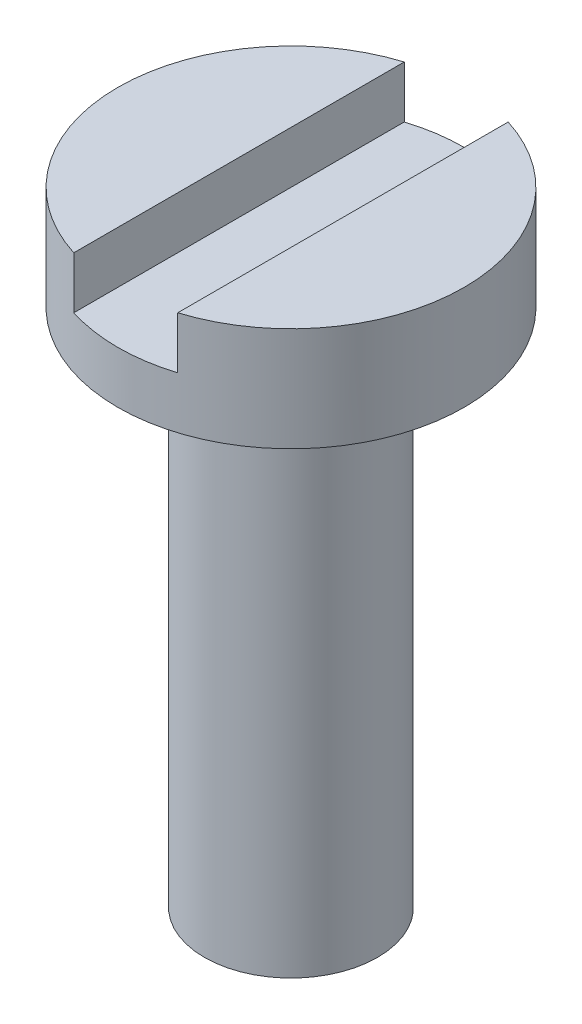
ISO-10303-21;
HEADER;
FILE_DESCRIPTION(('STEP AP214'),'2;1');
FILE_NAME('part.step','',(''),(''),'','','');
FILE_SCHEMA(('AUTOMOTIVE_DESIGN { 1 0 10303 214 1 1 1 1 }'));
ENDSEC;
DATA;
#1=APPLICATION_CONTEXT('core data for automotive mechanical design processes');
#2=APPLICATION_PROTOCOL_DEFINITION('international standard','automotive_design',2000,#1);
#3=PRODUCT_CONTEXT('',#1,'mechanical');
#4=PRODUCT('Part','Part','',(#3));
#5=PRODUCT_RELATED_PRODUCT_CATEGORY('part','',(#4));
#6=PRODUCT_DEFINITION_FORMATION('','',#4);
#7=PRODUCT_DEFINITION_CONTEXT('part definition',#1,'design');
#8=PRODUCT_DEFINITION('design','',#6,#7);
#9=PRODUCT_DEFINITION_SHAPE('','',#8);
#10=(LENGTH_UNIT() NAMED_UNIT(*) SI_UNIT(.MILLI.,.METRE.));
#11=(NAMED_UNIT(*) PLANE_ANGLE_UNIT() SI_UNIT($,.RADIAN.));
#12=(NAMED_UNIT(*) SI_UNIT($,.STERADIAN.) SOLID_ANGLE_UNIT());
#13=UNCERTAINTY_MEASURE_WITH_UNIT(LENGTH_MEASURE(1.E-05),#10,'distance_accuracy_value','');
#14=(GEOMETRIC_REPRESENTATION_CONTEXT(3) GLOBAL_UNCERTAINTY_ASSIGNED_CONTEXT((#13)) GLOBAL_UNIT_ASSIGNED_CONTEXT((#10,
#11,#12)) REPRESENTATION_CONTEXT('',''));
#15=CARTESIAN_POINT('',(0.,0.,0.));
#16=DIRECTION('',(0.,0.,1.));
#17=DIRECTION('',(1.,0.,0.));
#18=AXIS2_PLACEMENT_3D('',#15,#16,#17);
#19=CARTESIAN_POINT('',(0.,18.,0.));
#20=DIRECTION('',(0.,1.,0.));
#21=DIRECTION('',(0.,0.,1.));
#22=AXIS2_PLACEMENT_3D('',#19,#20,#21);
#23=PLANE('',#22);
#24=DIRECTION('',(0.,0.,-1.));
#25=VECTOR('',#24,1.);
#26=CARTESIAN_POINT('',(1.5,18.,-4.76969600708473));
#27=LINE('',#26,#25);
#28=CARTESIAN_POINT('',(1.5,18.,4.76969600708473));
#29=VERTEX_POINT('',#28);
#30=CARTESIAN_POINT('',(1.5,18.,-4.76969600708473));
#31=VERTEX_POINT('',#30);
#32=EDGE_CURVE('E82',#29,#31,#27,.T.);
#33=ORIENTED_EDGE('',*,*,#32,.F.);
#34=CARTESIAN_POINT('',(0.,18.,0.));
#35=DIRECTION('',(0.,1.,0.));
#36=DIRECTION('',(0.,0.,1.));
#37=AXIS2_PLACEMENT_3D('',#34,#35,#36);
#38=CIRCLE('',#37,5.);
#39=EDGE_CURVE('E128',#29,#31,#38,.T.);
#40=ORIENTED_EDGE('',*,*,#39,.T.);
#41=EDGE_LOOP('',(#33,#40));
#42=FACE_BOUND('',#41,.T.);
#43=ADVANCED_FACE('F43',(#42),#23,.T.);
#44=CARTESIAN_POINT('',(0.,15.,0.));
#45=DIRECTION('',(0.,-1.,0.));
#46=DIRECTION('',(0.,0.,-1.));
#47=AXIS2_PLACEMENT_3D('',#44,#45,#46);
#48=CYLINDRICAL_SURFACE('',#47,2.5);
#49=CARTESIAN_POINT('',(0.,15.,0.));
#50=DIRECTION('',(0.,1.,0.));
#51=DIRECTION('',(0.,0.,1.));
#52=AXIS2_PLACEMENT_3D('',#49,#50,#51);
#53=CIRCLE('',#52,2.5);
#54=CARTESIAN_POINT('',(0.,15.,2.5));
#55=VERTEX_POINT('',#54);
#56=EDGE_CURVE('E11',#55,#55,#53,.T.);
#57=ORIENTED_EDGE('',*,*,#56,.F.);
#58=EDGE_LOOP('',(#57));
#59=FACE_BOUND('',#58,.T.);
#60=CARTESIAN_POINT('',(0.,0.,0.));
#61=DIRECTION('',(0.,1.,0.));
#62=DIRECTION('',(0.,0.,1.));
#63=AXIS2_PLACEMENT_3D('',#60,#61,#62);
#64=CIRCLE('',#63,2.5);
#65=CARTESIAN_POINT('',(0.,0.,2.5));
#66=VERTEX_POINT('',#65);
#67=EDGE_CURVE('E47',#66,#66,#64,.T.);
#68=ORIENTED_EDGE('',*,*,#67,.T.);
#69=EDGE_LOOP('',(#68));
#70=FACE_BOUND('',#69,.T.);
#71=ADVANCED_FACE('F45',(#59,#70),#48,.T.);
#72=CARTESIAN_POINT('',(0.,0.,0.));
#73=DIRECTION('',(0.,1.,0.));
#74=DIRECTION('',(0.,0.,1.));
#75=AXIS2_PLACEMENT_3D('',#72,#73,#74);
#76=PLANE('',#75);
#77=ORIENTED_EDGE('',*,*,#67,.F.);
#78=EDGE_LOOP('',(#77));
#79=FACE_BOUND('',#78,.T.);
#80=ADVANCED_FACE('F146',(#79),#76,.F.);
#81=CARTESIAN_POINT('',(0.,18.,0.));
#82=DIRECTION('',(0.,-1.,0.));
#83=DIRECTION('',(0.,0.,-1.));
#84=AXIS2_PLACEMENT_3D('',#81,#82,#83);
#85=CYLINDRICAL_SURFACE('',#84,5.);
#86=CARTESIAN_POINT('',(0.,16.5,0.));
#87=DIRECTION('',(0.,1.,0.));
#88=DIRECTION('',(0.,0.,1.));
#89=AXIS2_PLACEMENT_3D('',#86,#87,#88);
#90=CIRCLE('',#89,5.);
#91=CARTESIAN_POINT('',(1.5,16.5,-4.76969600708473));
#92=VERTEX_POINT('',#91);
#93=CARTESIAN_POINT('',(-1.5,16.5,-4.76969600708473));
#94=VERTEX_POINT('',#93);
#95=EDGE_CURVE('E103',#92,#94,#90,.T.);
#96=ORIENTED_EDGE('',*,*,#95,.F.);
#97=DIRECTION('',(0.,1.,0.));
#98=VECTOR('',#97,1.);
#99=CARTESIAN_POINT('',(1.5,16.5,-4.76969600708473));
#100=LINE('',#99,#98);
#101=EDGE_CURVE('E68',#92,#31,#100,.T.);
#102=ORIENTED_EDGE('',*,*,#101,.T.);
#103=ORIENTED_EDGE('',*,*,#39,.F.);
#104=DIRECTION('',(0.,1.,0.));
#105=VECTOR('',#104,1.);
#106=CARTESIAN_POINT('',(1.5,16.5,4.76969600708473));
#107=LINE('',#106,#105);
#108=CARTESIAN_POINT('',(1.5,16.5,4.76969600708473));
#109=VERTEX_POINT('',#108);
#110=EDGE_CURVE('E97',#109,#29,#107,.T.);
#111=ORIENTED_EDGE('',*,*,#110,.F.);
#112=CARTESIAN_POINT('',(0.,16.5,0.));
#113=DIRECTION('',(0.,1.,0.));
#114=DIRECTION('',(0.,0.,1.));
#115=AXIS2_PLACEMENT_3D('',#112,#113,#114);
#116=CIRCLE('',#115,5.);
#117=CARTESIAN_POINT('',(-1.5,16.5,4.76969600708473));
#118=VERTEX_POINT('',#117);
#119=EDGE_CURVE('E101',#118,#109,#116,.T.);
#120=ORIENTED_EDGE('',*,*,#119,.F.);
#121=DIRECTION('',(0.,1.,0.));
#122=VECTOR('',#121,1.);
#123=CARTESIAN_POINT('',(-1.5,16.5,4.76969600708473));
#124=LINE('',#123,#122);
#125=CARTESIAN_POINT('',(-1.5,18.,4.76969600708473));
#126=VERTEX_POINT('',#125);
#127=EDGE_CURVE('E89',#118,#126,#124,.T.);
#128=ORIENTED_EDGE('',*,*,#127,.T.);
#129=CARTESIAN_POINT('',(-1.5,18.,-4.76969600708473));
#130=VERTEX_POINT('',#129);
#131=EDGE_CURVE('E132',#130,#126,#38,.T.);
#132=ORIENTED_EDGE('',*,*,#131,.F.);
#133=DIRECTION('',(0.,1.,0.));
#134=VECTOR('',#133,1.);
#135=CARTESIAN_POINT('',(-1.5,16.5,-4.76969600708473));
#136=LINE('',#135,#134);
#137=EDGE_CURVE('E59',#94,#130,#136,.T.);
#138=ORIENTED_EDGE('',*,*,#137,.F.);
#139=EDGE_LOOP('',(#96,#102,#103,#111,#120,#128,#132,#138));
#140=FACE_BOUND('',#139,.T.);
#141=CARTESIAN_POINT('',(0.,15.,0.));
#142=DIRECTION('',(0.,1.,0.));
#143=DIRECTION('',(0.,0.,1.));
#144=AXIS2_PLACEMENT_3D('',#141,#142,#143);
#145=CIRCLE('',#144,5.);
#146=CARTESIAN_POINT('',(0.,15.,5.));
#147=VERTEX_POINT('',#146);
#148=EDGE_CURVE('E123',#147,#147,#145,.T.);
#149=ORIENTED_EDGE('',*,*,#148,.T.);
#150=EDGE_LOOP('',(#149));
#151=FACE_BOUND('',#150,.T.);
#152=ADVANCED_FACE('F107',(#140,#151),#85,.T.);
#153=DIRECTION('',(0.,0.,1.));
#154=VECTOR('',#153,1.);
#155=CARTESIAN_POINT('',(-1.5,18.,-4.76969600708473));
#156=LINE('',#155,#154);
#157=EDGE_CURVE('E91',#130,#126,#156,.T.);
#158=ORIENTED_EDGE('',*,*,#157,.F.);
#159=ORIENTED_EDGE('',*,*,#131,.T.);
#160=EDGE_LOOP('',(#158,#159));
#161=FACE_BOUND('',#160,.T.);
#162=ADVANCED_FACE('F138',(#161),#23,.T.);
#163=CARTESIAN_POINT('',(0.,15.,0.));
#164=DIRECTION('',(0.,1.,0.));
#165=DIRECTION('',(0.,0.,1.));
#166=AXIS2_PLACEMENT_3D('',#163,#164,#165);
#167=PLANE('',#166);
#168=ORIENTED_EDGE('',*,*,#56,.T.);
#169=EDGE_LOOP('',(#168));
#170=FACE_BOUND('',#169,.T.);
#171=ORIENTED_EDGE('',*,*,#148,.F.);
#172=EDGE_LOOP('',(#171));
#173=FACE_BOUND('',#172,.T.);
#174=ADVANCED_FACE('F151',(#170,#173),#167,.F.);
#175=CARTESIAN_POINT('',(1.5,16.5,-4.76969600708473));
#176=DIRECTION('',(1.,0.,0.));
#177=DIRECTION('',(0.,0.,-1.));
#178=AXIS2_PLACEMENT_3D('',#175,#176,#177);
#179=PLANE('',#178);
#180=ORIENTED_EDGE('',*,*,#32,.T.);
#181=ORIENTED_EDGE('',*,*,#101,.F.);
#182=DIRECTION('',(0.,0.,-1.));
#183=VECTOR('',#182,1.);
#184=CARTESIAN_POINT('',(1.5,16.5,-4.76969600708473));
#185=LINE('',#184,#183);
#186=EDGE_CURVE('E111',#109,#92,#185,.T.);
#187=ORIENTED_EDGE('',*,*,#186,.F.);
#188=ORIENTED_EDGE('',*,*,#110,.T.);
#189=EDGE_LOOP('',(#180,#181,#187,#188));
#190=FACE_BOUND('',#189,.T.);
#191=ADVANCED_FACE('F156',(#190),#179,.F.);
#192=CARTESIAN_POINT('',(-1.5,16.5,-4.76969600708473));
#193=DIRECTION('',(-1.,0.,0.));
#194=DIRECTION('',(0.,0.,1.));
#195=AXIS2_PLACEMENT_3D('',#192,#193,#194);
#196=PLANE('',#195);
#197=ORIENTED_EDGE('',*,*,#157,.T.);
#198=ORIENTED_EDGE('',*,*,#127,.F.);
#199=DIRECTION('',(0.,0.,1.));
#200=VECTOR('',#199,1.);
#201=CARTESIAN_POINT('',(-1.5,16.5,-4.76969600708473));
#202=LINE('',#201,#200);
#203=EDGE_CURVE('E86',#94,#118,#202,.T.);
#204=ORIENTED_EDGE('',*,*,#203,.F.);
#205=ORIENTED_EDGE('',*,*,#137,.T.);
#206=EDGE_LOOP('',(#197,#198,#204,#205));
#207=FACE_BOUND('',#206,.T.);
#208=ADVANCED_FACE('F90',(#207),#196,.F.);
#209=CARTESIAN_POINT('',(0.,16.5,0.));
#210=DIRECTION('',(0.,1.,0.));
#211=DIRECTION('',(0.,0.,1.));
#212=AXIS2_PLACEMENT_3D('',#209,#210,#211);
#213=PLANE('',#212);
#214=ORIENTED_EDGE('',*,*,#95,.T.);
#215=ORIENTED_EDGE('',*,*,#203,.T.);
#216=ORIENTED_EDGE('',*,*,#119,.T.);
#217=ORIENTED_EDGE('',*,*,#186,.T.);
#218=EDGE_LOOP('',(#214,#215,#216,#217));
#219=FACE_BOUND('',#218,.T.);
#220=ADVANCED_FACE('F100',(#219),#213,.T.);
#221=CLOSED_SHELL('',(#43,#71,#80,#152,#162,#174,#191,#208,#220));
#222=MANIFOLD_SOLID_BREP('B2',#221);
#223=ADVANCED_BREP_SHAPE_REPRESENTATION('',(#18,#222),#14);
#224=SHAPE_DEFINITION_REPRESENTATION(#9,#223);
ENDSEC;
END-ISO-10303-21;
